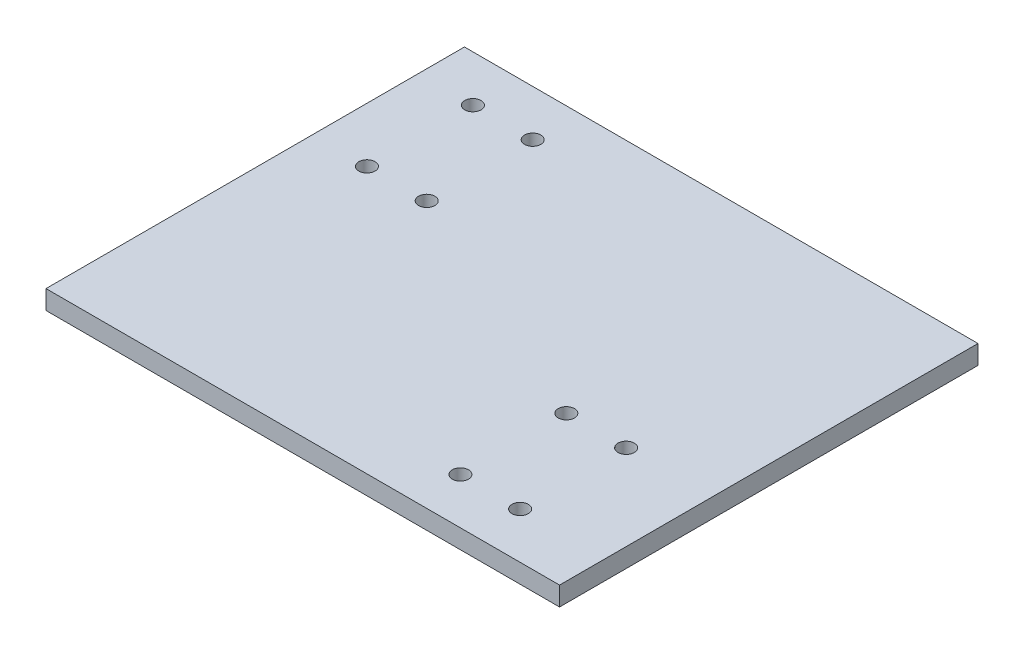
ISO-10303-21;
HEADER;
FILE_DESCRIPTION(('STEP AP214'),'2;1');
FILE_NAME('part.step','',(''),(''),'','','');
FILE_SCHEMA(('AUTOMOTIVE_DESIGN { 1 0 10303 214 1 1 1 1 }'));
ENDSEC;
DATA;
#1=APPLICATION_CONTEXT('core data for automotive mechanical design processes');
#2=APPLICATION_PROTOCOL_DEFINITION('international standard','automotive_design',2000,#1);
#3=PRODUCT_CONTEXT('',#1,'mechanical');
#4=PRODUCT('Part','Part','',(#3));
#5=PRODUCT_RELATED_PRODUCT_CATEGORY('part','',(#4));
#6=PRODUCT_DEFINITION_FORMATION('','',#4);
#7=PRODUCT_DEFINITION_CONTEXT('part definition',#1,'design');
#8=PRODUCT_DEFINITION('design','',#6,#7);
#9=PRODUCT_DEFINITION_SHAPE('','',#8);
#10=(LENGTH_UNIT() NAMED_UNIT(*) SI_UNIT(.MILLI.,.METRE.));
#11=(NAMED_UNIT(*) PLANE_ANGLE_UNIT() SI_UNIT($,.RADIAN.));
#12=(NAMED_UNIT(*) SI_UNIT($,.STERADIAN.) SOLID_ANGLE_UNIT());
#13=UNCERTAINTY_MEASURE_WITH_UNIT(LENGTH_MEASURE(1.E-05),#10,'distance_accuracy_value','');
#14=(GEOMETRIC_REPRESENTATION_CONTEXT(3) GLOBAL_UNCERTAINTY_ASSIGNED_CONTEXT((#13)) GLOBAL_UNIT_ASSIGNED_CONTEXT((#10,
#11,#12)) REPRESENTATION_CONTEXT('',''));
#15=CARTESIAN_POINT('',(0.,0.,0.));
#16=DIRECTION('',(0.,0.,1.));
#17=DIRECTION('',(1.,0.,0.));
#18=AXIS2_PLACEMENT_3D('',#15,#16,#17);
#19=CARTESIAN_POINT('',(94.5,7.,0.));
#20=DIRECTION('',(1.,0.,0.));
#21=DIRECTION('',(0.,0.,-1.));
#22=AXIS2_PLACEMENT_3D('',#19,#20,#21);
#23=PLANE('',#22);
#24=DIRECTION('',(0.,0.,1.));
#25=VECTOR('',#24,1.);
#26=CARTESIAN_POINT('',(94.5,0.,0.));
#27=LINE('',#26,#25);
#28=CARTESIAN_POINT('',(94.5,0.,-77.));
#29=VERTEX_POINT('',#28);
#30=CARTESIAN_POINT('',(94.5,0.,77.));
#31=VERTEX_POINT('',#30);
#32=EDGE_CURVE('E137',#29,#31,#27,.T.);
#33=ORIENTED_EDGE('',*,*,#32,.F.);
#34=DIRECTION('',(0.,-1.,0.));
#35=VECTOR('',#34,1.);
#36=CARTESIAN_POINT('',(94.5,7.,-77.));
#37=LINE('',#36,#35);
#38=CARTESIAN_POINT('',(94.5,7.,-77.));
#39=VERTEX_POINT('',#38);
#40=EDGE_CURVE('E11',#39,#29,#37,.T.);
#41=ORIENTED_EDGE('',*,*,#40,.F.);
#42=DIRECTION('',(0.,0.,1.));
#43=VECTOR('',#42,1.);
#44=CARTESIAN_POINT('',(94.5,7.,0.));
#45=LINE('',#44,#43);
#46=CARTESIAN_POINT('',(94.5,7.,77.));
#47=VERTEX_POINT('',#46);
#48=EDGE_CURVE('E106',#39,#47,#45,.T.);
#49=ORIENTED_EDGE('',*,*,#48,.T.);
#50=DIRECTION('',(0.,-1.,0.));
#51=VECTOR('',#50,1.);
#52=CARTESIAN_POINT('',(94.5,7.,77.));
#53=LINE('',#52,#51);
#54=EDGE_CURVE('E85',#47,#31,#53,.T.);
#55=ORIENTED_EDGE('',*,*,#54,.T.);
#56=EDGE_LOOP('',(#33,#41,#49,#55));
#57=FACE_BOUND('',#56,.T.);
#58=ADVANCED_FACE('F45',(#57),#23,.T.);
#59=CARTESIAN_POINT('',(0.,7.,-77.));
#60=DIRECTION('',(0.,0.,-1.));
#61=DIRECTION('',(-1.,0.,0.));
#62=AXIS2_PLACEMENT_3D('',#59,#60,#61);
#63=PLANE('',#62);
#64=DIRECTION('',(1.,0.,0.));
#65=VECTOR('',#64,1.);
#66=CARTESIAN_POINT('',(0.,0.,-77.));
#67=LINE('',#66,#65);
#68=CARTESIAN_POINT('',(-94.5,0.,-77.));
#69=VERTEX_POINT('',#68);
#70=EDGE_CURVE('E97',#69,#29,#67,.T.);
#71=ORIENTED_EDGE('',*,*,#70,.F.);
#72=DIRECTION('',(0.,-1.,0.));
#73=VECTOR('',#72,1.);
#74=CARTESIAN_POINT('',(-94.5,7.,-77.));
#75=LINE('',#74,#73);
#76=CARTESIAN_POINT('',(-94.5,7.,-77.));
#77=VERTEX_POINT('',#76);
#78=EDGE_CURVE('E54',#77,#69,#75,.T.);
#79=ORIENTED_EDGE('',*,*,#78,.F.);
#80=DIRECTION('',(1.,0.,0.));
#81=VECTOR('',#80,1.);
#82=CARTESIAN_POINT('',(0.,7.,-77.));
#83=LINE('',#82,#81);
#84=EDGE_CURVE('E95',#77,#39,#83,.T.);
#85=ORIENTED_EDGE('',*,*,#84,.T.);
#86=ORIENTED_EDGE('',*,*,#40,.T.);
#87=EDGE_LOOP('',(#71,#79,#85,#86));
#88=FACE_BOUND('',#87,.T.);
#89=ADVANCED_FACE('F93',(#88),#63,.T.);
#90=CARTESIAN_POINT('',(-94.5,7.,0.));
#91=DIRECTION('',(1.,0.,0.));
#92=DIRECTION('',(0.,0.,-1.));
#93=AXIS2_PLACEMENT_3D('',#90,#91,#92);
#94=PLANE('',#93);
#95=DIRECTION('',(0.,0.,1.));
#96=VECTOR('',#95,1.);
#97=CARTESIAN_POINT('',(-94.5,0.,0.));
#98=LINE('',#97,#96);
#99=CARTESIAN_POINT('',(-94.5,0.,77.));
#100=VERTEX_POINT('',#99);
#101=EDGE_CURVE('E140',#69,#100,#98,.T.);
#102=ORIENTED_EDGE('',*,*,#101,.T.);
#103=DIRECTION('',(0.,-1.,0.));
#104=VECTOR('',#103,1.);
#105=CARTESIAN_POINT('',(-94.5,7.,77.));
#106=LINE('',#105,#104);
#107=CARTESIAN_POINT('',(-94.5,7.,77.));
#108=VERTEX_POINT('',#107);
#109=EDGE_CURVE('E100',#108,#100,#106,.T.);
#110=ORIENTED_EDGE('',*,*,#109,.F.);
#111=DIRECTION('',(0.,0.,1.));
#112=VECTOR('',#111,1.);
#113=CARTESIAN_POINT('',(-94.5,7.,0.));
#114=LINE('',#113,#112);
#115=EDGE_CURVE('E102',#77,#108,#114,.T.);
#116=ORIENTED_EDGE('',*,*,#115,.F.);
#117=ORIENTED_EDGE('',*,*,#78,.T.);
#118=EDGE_LOOP('',(#102,#110,#116,#117));
#119=FACE_BOUND('',#118,.T.);
#120=ADVANCED_FACE('F103',(#119),#94,.F.);
#121=CARTESIAN_POINT('',(41.,7.,60.));
#122=DIRECTION('',(0.,-1.,0.));
#123=DIRECTION('',(0.,0.,-1.));
#124=AXIS2_PLACEMENT_3D('',#121,#122,#123);
#125=CYLINDRICAL_SURFACE('',#124,3.);
#126=CARTESIAN_POINT('',(41.,7.,60.));
#127=DIRECTION('',(0.,1.,0.));
#128=DIRECTION('',(0.,0.,1.));
#129=AXIS2_PLACEMENT_3D('',#126,#127,#128);
#130=CIRCLE('',#129,3.);
#131=CARTESIAN_POINT('',(41.,7.,63.));
#132=VERTEX_POINT('',#131);
#133=EDGE_CURVE('E108',#132,#132,#130,.T.);
#134=ORIENTED_EDGE('',*,*,#133,.T.);
#135=EDGE_LOOP('',(#134));
#136=FACE_BOUND('',#135,.T.);
#137=CARTESIAN_POINT('',(41.,0.,60.));
#138=DIRECTION('',(0.,1.,0.));
#139=DIRECTION('',(0.,0.,1.));
#140=AXIS2_PLACEMENT_3D('',#137,#138,#139);
#141=CIRCLE('',#140,3.);
#142=CARTESIAN_POINT('',(41.,0.,63.));
#143=VERTEX_POINT('',#142);
#144=EDGE_CURVE('E134',#143,#143,#141,.T.);
#145=ORIENTED_EDGE('',*,*,#144,.F.);
#146=EDGE_LOOP('',(#145));
#147=FACE_BOUND('',#146,.T.);
#148=ADVANCED_FACE('F156',(#136,#147),#125,.F.);
#149=CARTESIAN_POINT('',(63.,7.,60.));
#150=DIRECTION('',(0.,-1.,0.));
#151=DIRECTION('',(0.,0.,-1.));
#152=AXIS2_PLACEMENT_3D('',#149,#150,#151);
#153=CYLINDRICAL_SURFACE('',#152,3.00000000000001);
#154=CARTESIAN_POINT('',(63.,7.,60.));
#155=DIRECTION('',(0.,1.,0.));
#156=DIRECTION('',(0.,0.,1.));
#157=AXIS2_PLACEMENT_3D('',#154,#155,#156);
#158=CIRCLE('',#157,3.00000000000001);
#159=CARTESIAN_POINT('',(63.,7.,63.));
#160=VERTEX_POINT('',#159);
#161=EDGE_CURVE('E330',#160,#160,#158,.T.);
#162=ORIENTED_EDGE('',*,*,#161,.T.);
#163=EDGE_LOOP('',(#162));
#164=FACE_BOUND('',#163,.T.);
#165=CARTESIAN_POINT('',(63.,0.,60.));
#166=DIRECTION('',(0.,1.,0.));
#167=DIRECTION('',(0.,0.,1.));
#168=AXIS2_PLACEMENT_3D('',#165,#166,#167);
#169=CIRCLE('',#168,3.00000000000001);
#170=CARTESIAN_POINT('',(63.,0.,63.));
#171=VERTEX_POINT('',#170);
#172=EDGE_CURVE('E131',#171,#171,#169,.T.);
#173=ORIENTED_EDGE('',*,*,#172,.F.);
#174=EDGE_LOOP('',(#173));
#175=FACE_BOUND('',#174,.T.);
#176=ADVANCED_FACE('F159',(#164,#175),#153,.F.);
#177=CARTESIAN_POINT('',(41.,7.,21.));
#178=DIRECTION('',(0.,-1.,0.));
#179=DIRECTION('',(0.,0.,-1.));
#180=AXIS2_PLACEMENT_3D('',#177,#178,#179);
#181=CYLINDRICAL_SURFACE('',#180,3.);
#182=CARTESIAN_POINT('',(41.,7.,21.));
#183=DIRECTION('',(0.,1.,0.));
#184=DIRECTION('',(0.,0.,1.));
#185=AXIS2_PLACEMENT_3D('',#182,#183,#184);
#186=CIRCLE('',#185,3.);
#187=CARTESIAN_POINT('',(41.,7.,24.));
#188=VERTEX_POINT('',#187);
#189=EDGE_CURVE('E326',#188,#188,#186,.T.);
#190=ORIENTED_EDGE('',*,*,#189,.T.);
#191=EDGE_LOOP('',(#190));
#192=FACE_BOUND('',#191,.T.);
#193=CARTESIAN_POINT('',(41.,0.,21.));
#194=DIRECTION('',(0.,1.,0.));
#195=DIRECTION('',(0.,0.,1.));
#196=AXIS2_PLACEMENT_3D('',#193,#194,#195);
#197=CIRCLE('',#196,3.);
#198=CARTESIAN_POINT('',(41.,0.,24.));
#199=VERTEX_POINT('',#198);
#200=EDGE_CURVE('E128',#199,#199,#197,.T.);
#201=ORIENTED_EDGE('',*,*,#200,.F.);
#202=EDGE_LOOP('',(#201));
#203=FACE_BOUND('',#202,.T.);
#204=ADVANCED_FACE('F163',(#192,#203),#181,.F.);
#205=CARTESIAN_POINT('',(63.,7.,21.));
#206=DIRECTION('',(0.,-1.,0.));
#207=DIRECTION('',(0.,0.,-1.));
#208=AXIS2_PLACEMENT_3D('',#205,#206,#207);
#209=CYLINDRICAL_SURFACE('',#208,2.99999999999999);
#210=CARTESIAN_POINT('',(63.,7.,21.));
#211=DIRECTION('',(0.,1.,0.));
#212=DIRECTION('',(0.,0.,1.));
#213=AXIS2_PLACEMENT_3D('',#210,#211,#212);
#214=CIRCLE('',#213,2.99999999999999);
#215=CARTESIAN_POINT('',(63.,7.,24.));
#216=VERTEX_POINT('',#215);
#217=EDGE_CURVE('E322',#216,#216,#214,.T.);
#218=ORIENTED_EDGE('',*,*,#217,.T.);
#219=EDGE_LOOP('',(#218));
#220=FACE_BOUND('',#219,.T.);
#221=CARTESIAN_POINT('',(63.,0.,21.));
#222=DIRECTION('',(0.,1.,0.));
#223=DIRECTION('',(0.,0.,1.));
#224=AXIS2_PLACEMENT_3D('',#221,#222,#223);
#225=CIRCLE('',#224,2.99999999999999);
#226=CARTESIAN_POINT('',(63.,0.,24.));
#227=VERTEX_POINT('',#226);
#228=EDGE_CURVE('E125',#227,#227,#225,.T.);
#229=ORIENTED_EDGE('',*,*,#228,.F.);
#230=EDGE_LOOP('',(#229));
#231=FACE_BOUND('',#230,.T.);
#232=ADVANCED_FACE('F167',(#220,#231),#209,.F.);
#233=CARTESIAN_POINT('',(-74.39,7.,-60.));
#234=DIRECTION('',(0.,-1.,0.));
#235=DIRECTION('',(0.,0.,-1.));
#236=AXIS2_PLACEMENT_3D('',#233,#234,#235);
#237=CYLINDRICAL_SURFACE('',#236,3.00000000000001);
#238=CARTESIAN_POINT('',(-74.39,7.,-60.));
#239=DIRECTION('',(0.,1.,0.));
#240=DIRECTION('',(0.,0.,1.));
#241=AXIS2_PLACEMENT_3D('',#238,#239,#240);
#242=CIRCLE('',#241,3.00000000000001);
#243=CARTESIAN_POINT('',(-74.39,7.,-57.));
#244=VERTEX_POINT('',#243);
#245=EDGE_CURVE('E318',#244,#244,#242,.T.);
#246=ORIENTED_EDGE('',*,*,#245,.T.);
#247=EDGE_LOOP('',(#246));
#248=FACE_BOUND('',#247,.T.);
#249=CARTESIAN_POINT('',(-74.39,0.,-60.));
#250=DIRECTION('',(0.,1.,0.));
#251=DIRECTION('',(0.,0.,1.));
#252=AXIS2_PLACEMENT_3D('',#249,#250,#251);
#253=CIRCLE('',#252,3.00000000000001);
#254=CARTESIAN_POINT('',(-74.39,0.,-57.));
#255=VERTEX_POINT('',#254);
#256=EDGE_CURVE('E122',#255,#255,#253,.T.);
#257=ORIENTED_EDGE('',*,*,#256,.F.);
#258=EDGE_LOOP('',(#257));
#259=FACE_BOUND('',#258,.T.);
#260=ADVANCED_FACE('F171',(#248,#259),#237,.F.);
#261=CARTESIAN_POINT('',(-52.39,7.,-60.));
#262=DIRECTION('',(0.,-1.,0.));
#263=DIRECTION('',(0.,0.,-1.));
#264=AXIS2_PLACEMENT_3D('',#261,#262,#263);
#265=CYLINDRICAL_SURFACE('',#264,3.);
#266=CARTESIAN_POINT('',(-52.39,7.,-60.));
#267=DIRECTION('',(0.,1.,0.));
#268=DIRECTION('',(0.,0.,1.));
#269=AXIS2_PLACEMENT_3D('',#266,#267,#268);
#270=CIRCLE('',#269,3.);
#271=CARTESIAN_POINT('',(-52.39,7.,-57.));
#272=VERTEX_POINT('',#271);
#273=EDGE_CURVE('E314',#272,#272,#270,.T.);
#274=ORIENTED_EDGE('',*,*,#273,.T.);
#275=EDGE_LOOP('',(#274));
#276=FACE_BOUND('',#275,.T.);
#277=CARTESIAN_POINT('',(-52.39,0.,-60.));
#278=DIRECTION('',(0.,1.,0.));
#279=DIRECTION('',(0.,0.,1.));
#280=AXIS2_PLACEMENT_3D('',#277,#278,#279);
#281=CIRCLE('',#280,3.);
#282=CARTESIAN_POINT('',(-52.39,0.,-57.));
#283=VERTEX_POINT('',#282);
#284=EDGE_CURVE('E119',#283,#283,#281,.T.);
#285=ORIENTED_EDGE('',*,*,#284,.F.);
#286=EDGE_LOOP('',(#285));
#287=FACE_BOUND('',#286,.T.);
#288=ADVANCED_FACE('F175',(#276,#287),#265,.F.);
#289=CARTESIAN_POINT('',(-74.39,7.,-21.));
#290=DIRECTION('',(0.,-1.,0.));
#291=DIRECTION('',(0.,0.,-1.));
#292=AXIS2_PLACEMENT_3D('',#289,#290,#291);
#293=CYLINDRICAL_SURFACE('',#292,2.99999999999999);
#294=CARTESIAN_POINT('',(-74.39,7.,-21.));
#295=DIRECTION('',(0.,1.,0.));
#296=DIRECTION('',(0.,0.,1.));
#297=AXIS2_PLACEMENT_3D('',#294,#295,#296);
#298=CIRCLE('',#297,2.99999999999999);
#299=CARTESIAN_POINT('',(-74.39,7.,-18.));
#300=VERTEX_POINT('',#299);
#301=EDGE_CURVE('E189',#300,#300,#298,.T.);
#302=ORIENTED_EDGE('',*,*,#301,.T.);
#303=EDGE_LOOP('',(#302));
#304=FACE_BOUND('',#303,.T.);
#305=CARTESIAN_POINT('',(-74.39,0.,-21.));
#306=DIRECTION('',(0.,1.,0.));
#307=DIRECTION('',(0.,0.,1.));
#308=AXIS2_PLACEMENT_3D('',#305,#306,#307);
#309=CIRCLE('',#308,2.99999999999999);
#310=CARTESIAN_POINT('',(-74.39,0.,-18.));
#311=VERTEX_POINT('',#310);
#312=EDGE_CURVE('E116',#311,#311,#309,.T.);
#313=ORIENTED_EDGE('',*,*,#312,.F.);
#314=EDGE_LOOP('',(#313));
#315=FACE_BOUND('',#314,.T.);
#316=ADVANCED_FACE('F178',(#304,#315),#293,.F.);
#317=CARTESIAN_POINT('',(-52.39,7.,-21.));
#318=DIRECTION('',(0.,-1.,0.));
#319=DIRECTION('',(0.,0.,-1.));
#320=AXIS2_PLACEMENT_3D('',#317,#318,#319);
#321=CYLINDRICAL_SURFACE('',#320,3.);
#322=CARTESIAN_POINT('',(-52.39,7.,-21.));
#323=DIRECTION('',(0.,1.,0.));
#324=DIRECTION('',(0.,0.,1.));
#325=AXIS2_PLACEMENT_3D('',#322,#323,#324);
#326=CIRCLE('',#325,3.);
#327=CARTESIAN_POINT('',(-52.39,7.,-18.));
#328=VERTEX_POINT('',#327);
#329=EDGE_CURVE('E143',#328,#328,#326,.T.);
#330=ORIENTED_EDGE('',*,*,#329,.T.);
#331=EDGE_LOOP('',(#330));
#332=FACE_BOUND('',#331,.T.);
#333=CARTESIAN_POINT('',(-52.39,0.,-21.));
#334=DIRECTION('',(0.,1.,0.));
#335=DIRECTION('',(0.,0.,1.));
#336=AXIS2_PLACEMENT_3D('',#333,#334,#335);
#337=CIRCLE('',#336,3.);
#338=CARTESIAN_POINT('',(-52.39,0.,-18.));
#339=VERTEX_POINT('',#338);
#340=EDGE_CURVE('E113',#339,#339,#337,.T.);
#341=ORIENTED_EDGE('',*,*,#340,.F.);
#342=EDGE_LOOP('',(#341));
#343=FACE_BOUND('',#342,.T.);
#344=ADVANCED_FACE('F47',(#332,#343),#321,.F.);
#345=CARTESIAN_POINT('',(0.,7.,77.));
#346=DIRECTION('',(0.,0.,-1.));
#347=DIRECTION('',(-1.,0.,0.));
#348=AXIS2_PLACEMENT_3D('',#345,#346,#347);
#349=PLANE('',#348);
#350=DIRECTION('',(1.,0.,0.));
#351=VECTOR('',#350,1.);
#352=CARTESIAN_POINT('',(0.,0.,77.));
#353=LINE('',#352,#351);
#354=EDGE_CURVE('E78',#100,#31,#353,.T.);
#355=ORIENTED_EDGE('',*,*,#354,.T.);
#356=ORIENTED_EDGE('',*,*,#54,.F.);
#357=DIRECTION('',(1.,0.,0.));
#358=VECTOR('',#357,1.);
#359=CARTESIAN_POINT('',(0.,7.,77.));
#360=LINE('',#359,#358);
#361=EDGE_CURVE('E62',#108,#47,#360,.T.);
#362=ORIENTED_EDGE('',*,*,#361,.F.);
#363=ORIENTED_EDGE('',*,*,#109,.T.);
#364=EDGE_LOOP('',(#355,#356,#362,#363));
#365=FACE_BOUND('',#364,.T.);
#366=ADVANCED_FACE('F146',(#365),#349,.F.);
#367=CARTESIAN_POINT('',(0.,7.,0.));
#368=DIRECTION('',(0.,1.,0.));
#369=DIRECTION('',(0.,0.,1.));
#370=AXIS2_PLACEMENT_3D('',#367,#368,#369);
#371=PLANE('',#370);
#372=ORIENTED_EDGE('',*,*,#329,.F.);
#373=EDGE_LOOP('',(#372));
#374=FACE_BOUND('',#373,.T.);
#375=ORIENTED_EDGE('',*,*,#301,.F.);
#376=EDGE_LOOP('',(#375));
#377=FACE_BOUND('',#376,.T.);
#378=ORIENTED_EDGE('',*,*,#273,.F.);
#379=EDGE_LOOP('',(#378));
#380=FACE_BOUND('',#379,.T.);
#381=ORIENTED_EDGE('',*,*,#245,.F.);
#382=EDGE_LOOP('',(#381));
#383=FACE_BOUND('',#382,.T.);
#384=ORIENTED_EDGE('',*,*,#217,.F.);
#385=EDGE_LOOP('',(#384));
#386=FACE_BOUND('',#385,.T.);
#387=ORIENTED_EDGE('',*,*,#189,.F.);
#388=EDGE_LOOP('',(#387));
#389=FACE_BOUND('',#388,.T.);
#390=ORIENTED_EDGE('',*,*,#161,.F.);
#391=EDGE_LOOP('',(#390));
#392=FACE_BOUND('',#391,.T.);
#393=ORIENTED_EDGE('',*,*,#133,.F.);
#394=EDGE_LOOP('',(#393));
#395=FACE_BOUND('',#394,.T.);
#396=ORIENTED_EDGE('',*,*,#48,.F.);
#397=ORIENTED_EDGE('',*,*,#84,.F.);
#398=ORIENTED_EDGE('',*,*,#115,.T.);
#399=ORIENTED_EDGE('',*,*,#361,.T.);
#400=EDGE_LOOP('',(#396,#397,#398,#399));
#401=FACE_BOUND('',#400,.T.);
#402=ADVANCED_FACE('F105',(#374,#377,#380,#383,#386,#389,#392,#395,#401),#371,.T.);
#403=CARTESIAN_POINT('',(0.,0.,0.));
#404=DIRECTION('',(0.,1.,0.));
#405=DIRECTION('',(0.,0.,1.));
#406=AXIS2_PLACEMENT_3D('',#403,#404,#405);
#407=PLANE('',#406);
#408=ORIENTED_EDGE('',*,*,#340,.T.);
#409=EDGE_LOOP('',(#408));
#410=FACE_BOUND('',#409,.T.);
#411=ORIENTED_EDGE('',*,*,#312,.T.);
#412=EDGE_LOOP('',(#411));
#413=FACE_BOUND('',#412,.T.);
#414=ORIENTED_EDGE('',*,*,#284,.T.);
#415=EDGE_LOOP('',(#414));
#416=FACE_BOUND('',#415,.T.);
#417=ORIENTED_EDGE('',*,*,#256,.T.);
#418=EDGE_LOOP('',(#417));
#419=FACE_BOUND('',#418,.T.);
#420=ORIENTED_EDGE('',*,*,#228,.T.);
#421=EDGE_LOOP('',(#420));
#422=FACE_BOUND('',#421,.T.);
#423=ORIENTED_EDGE('',*,*,#200,.T.);
#424=EDGE_LOOP('',(#423));
#425=FACE_BOUND('',#424,.T.);
#426=ORIENTED_EDGE('',*,*,#172,.T.);
#427=EDGE_LOOP('',(#426));
#428=FACE_BOUND('',#427,.T.);
#429=ORIENTED_EDGE('',*,*,#144,.T.);
#430=EDGE_LOOP('',(#429));
#431=FACE_BOUND('',#430,.T.);
#432=ORIENTED_EDGE('',*,*,#32,.T.);
#433=ORIENTED_EDGE('',*,*,#354,.F.);
#434=ORIENTED_EDGE('',*,*,#101,.F.);
#435=ORIENTED_EDGE('',*,*,#70,.T.);
#436=EDGE_LOOP('',(#432,#433,#434,#435));
#437=FACE_BOUND('',#436,.T.);
#438=ADVANCED_FACE('F147',(#410,#413,#416,#419,#422,#425,#428,#431,#437),#407,.F.);
#439=CLOSED_SHELL('',(#58,#89,#120,#148,#176,#204,#232,#260,#288,#316,#344,#366,#402,#438));
#440=MANIFOLD_SOLID_BREP('B2',#439);
#441=ADVANCED_BREP_SHAPE_REPRESENTATION('',(#18,#440),#14);
#442=SHAPE_DEFINITION_REPRESENTATION(#9,#441);
ENDSEC;
END-ISO-10303-21;
